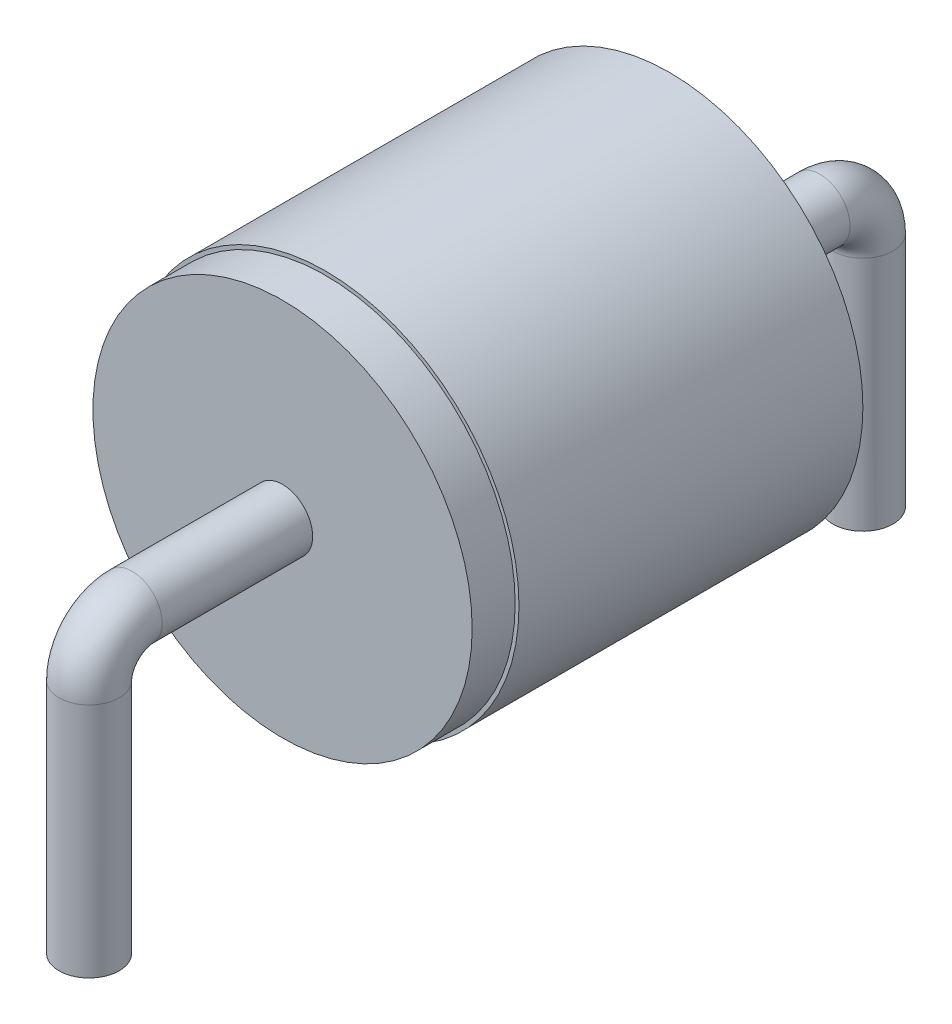
ISO-10303-21;
HEADER;
FILE_DESCRIPTION(('STEP AP214'),'2;1');
FILE_NAME('part.step','',(''),(''),'','','');
FILE_SCHEMA(('AUTOMOTIVE_DESIGN { 1 0 10303 214 1 1 1 1 }'));
ENDSEC;
DATA;
#1=APPLICATION_CONTEXT('core data for automotive mechanical design processes');
#2=APPLICATION_PROTOCOL_DEFINITION('international standard','automotive_design',2000,#1);
#3=PRODUCT_CONTEXT('',#1,'mechanical');
#4=PRODUCT('Part','Part','',(#3));
#5=PRODUCT_RELATED_PRODUCT_CATEGORY('part','',(#4));
#6=PRODUCT_DEFINITION_FORMATION('','',#4);
#7=PRODUCT_DEFINITION_CONTEXT('part definition',#1,'design');
#8=PRODUCT_DEFINITION('design','',#6,#7);
#9=PRODUCT_DEFINITION_SHAPE('','',#8);
#10=(LENGTH_UNIT() NAMED_UNIT(*) SI_UNIT(.MILLI.,.METRE.));
#11=(NAMED_UNIT(*) PLANE_ANGLE_UNIT() SI_UNIT($,.RADIAN.));
#12=(NAMED_UNIT(*) SI_UNIT($,.STERADIAN.) SOLID_ANGLE_UNIT());
#13=UNCERTAINTY_MEASURE_WITH_UNIT(LENGTH_MEASURE(1.E-05),#10,'distance_accuracy_value','');
#14=(GEOMETRIC_REPRESENTATION_CONTEXT(3) GLOBAL_UNCERTAINTY_ASSIGNED_CONTEXT((#13)) GLOBAL_UNIT_ASSIGNED_CONTEXT((#10,
#11,#12)) REPRESENTATION_CONTEXT('',''));
#15=CARTESIAN_POINT('',(0.,0.,0.));
#16=DIRECTION('',(0.,0.,1.));
#17=DIRECTION('',(1.,0.,0.));
#18=AXIS2_PLACEMENT_3D('',#15,#16,#17);
#19=CARTESIAN_POINT('',(0.,0.,4.5));
#20=DIRECTION('',(0.,0.,-1.));
#21=DIRECTION('',(-1.,0.,0.));
#22=AXIS2_PLACEMENT_3D('',#19,#20,#21);
#23=CYLINDRICAL_SURFACE('',#22,4.5);
#24=CARTESIAN_POINT('',(0.,0.,-4.5));
#25=DIRECTION('',(0.,0.,1.));
#26=DIRECTION('',(1.,0.,0.));
#27=AXIS2_PLACEMENT_3D('',#24,#25,#26);
#28=CIRCLE('',#27,4.5);
#29=CARTESIAN_POINT('',(4.5,0.,-4.5));
#30=VERTEX_POINT('',#29);
#31=EDGE_CURVE('E45',#30,#30,#28,.T.);
#32=ORIENTED_EDGE('',*,*,#31,.T.);
#33=EDGE_LOOP('',(#32));
#34=FACE_BOUND('',#33,.T.);
#35=CARTESIAN_POINT('',(0.,0.,3.5));
#36=DIRECTION('',(0.,0.,1.));
#37=DIRECTION('',(1.,0.,0.));
#38=AXIS2_PLACEMENT_3D('',#35,#36,#37);
#39=CIRCLE('',#38,4.5);
#40=CARTESIAN_POINT('',(4.5,0.,3.5));
#41=VERTEX_POINT('',#40);
#42=EDGE_CURVE('E53',#41,#41,#39,.T.);
#43=ORIENTED_EDGE('',*,*,#42,.F.);
#44=EDGE_LOOP('',(#43));
#45=FACE_BOUND('',#44,.T.);
#46=ADVANCED_FACE('F37',(#34,#45),#23,.T.);
#47=CARTESIAN_POINT('',(0.,0.,-4.5));
#48=DIRECTION('',(0.,0.,1.));
#49=DIRECTION('',(1.,0.,0.));
#50=AXIS2_PLACEMENT_3D('',#47,#48,#49);
#51=PLANE('',#50);
#52=CARTESIAN_POINT('',(0.,0.,-4.5));
#53=DIRECTION('',(0.,0.,1.));
#54=DIRECTION('',(1.,0.,0.));
#55=AXIS2_PLACEMENT_3D('',#52,#53,#54);
#56=CIRCLE('',#55,0.7);
#57=CARTESIAN_POINT('',(0.7,0.,-4.5));
#58=VERTEX_POINT('',#57);
#59=EDGE_CURVE('E10',#58,#58,#56,.F.);
#60=ORIENTED_EDGE('',*,*,#59,.F.);
#61=EDGE_LOOP('',(#60));
#62=FACE_BOUND('',#61,.T.);
#63=ORIENTED_EDGE('',*,*,#31,.F.);
#64=EDGE_LOOP('',(#63));
#65=FACE_BOUND('',#64,.T.);
#66=ADVANCED_FACE('F72',(#62,#65),#51,.F.);
#67=CARTESIAN_POINT('',(0.,0.,3.5));
#68=DIRECTION('',(0.,0.,1.));
#69=DIRECTION('',(1.,0.,0.));
#70=AXIS2_PLACEMENT_3D('',#67,#68,#69);
#71=PLANE('',#70);
#72=CARTESIAN_POINT('',(0.,0.,3.5));
#73=DIRECTION('',(0.,0.,1.));
#74=DIRECTION('',(1.,0.,0.));
#75=AXIS2_PLACEMENT_3D('',#72,#73,#74);
#76=CIRCLE('',#75,4.41094768565532);
#77=CARTESIAN_POINT('',(4.41094768565532,0.,3.5));
#78=VERTEX_POINT('',#77);
#79=EDGE_CURVE('E59',#78,#78,#76,.T.);
#80=ORIENTED_EDGE('',*,*,#79,.F.);
#81=EDGE_LOOP('',(#80));
#82=FACE_BOUND('',#81,.T.);
#83=ORIENTED_EDGE('',*,*,#42,.T.);
#84=EDGE_LOOP('',(#83));
#85=FACE_BOUND('',#84,.T.);
#86=ADVANCED_FACE('F69',(#82,#85),#71,.T.);
#87=CARTESIAN_POINT('',(0.,0.,3.5));
#88=DIRECTION('',(0.,0.,1.));
#89=DIRECTION('',(1.,0.,0.));
#90=AXIS2_PLACEMENT_3D('',#87,#88,#89);
#91=CYLINDRICAL_SURFACE('',#90,4.41094768565532);
#92=ORIENTED_EDGE('',*,*,#79,.T.);
#93=EDGE_LOOP('',(#92));
#94=FACE_BOUND('',#93,.T.);
#95=CARTESIAN_POINT('',(0.,0.,4.5));
#96=DIRECTION('',(0.,0.,1.));
#97=DIRECTION('',(1.,0.,0.));
#98=AXIS2_PLACEMENT_3D('',#95,#96,#97);
#99=CIRCLE('',#98,4.41094768565532);
#100=CARTESIAN_POINT('',(4.41094768565532,0.,4.5));
#101=VERTEX_POINT('',#100);
#102=EDGE_CURVE('E63',#101,#101,#99,.T.);
#103=ORIENTED_EDGE('',*,*,#102,.F.);
#104=EDGE_LOOP('',(#103));
#105=FACE_BOUND('',#104,.T.);
#106=ADVANCED_FACE('F83',(#94,#105),#91,.T.);
#107=CARTESIAN_POINT('',(0.,0.,4.5));
#108=DIRECTION('',(0.,0.,1.));
#109=DIRECTION('',(1.,0.,0.));
#110=AXIS2_PLACEMENT_3D('',#107,#108,#109);
#111=PLANE('',#110);
#112=CARTESIAN_POINT('',(0.,0.,4.5));
#113=DIRECTION('',(0.,0.,1.));
#114=DIRECTION('',(1.,0.,0.));
#115=AXIS2_PLACEMENT_3D('',#112,#113,#114);
#116=CIRCLE('',#115,0.7);
#117=CARTESIAN_POINT('',(0.7,0.,4.5));
#118=VERTEX_POINT('',#117);
#119=EDGE_CURVE('E40',#118,#118,#116,.F.);
#120=ORIENTED_EDGE('',*,*,#119,.T.);
#121=EDGE_LOOP('',(#120));
#122=FACE_BOUND('',#121,.T.);
#123=ORIENTED_EDGE('',*,*,#102,.T.);
#124=EDGE_LOOP('',(#123));
#125=FACE_BOUND('',#124,.T.);
#126=ADVANCED_FACE('F87',(#122,#125),#111,.T.);
#127=CARTESIAN_POINT('',(0.,-6.5,9.));
#128=DIRECTION('',(0.,-1.,0.));
#129=DIRECTION('',(1.,0.,0.));
#130=AXIS2_PLACEMENT_3D('',#127,#128,#129);
#131=PLANE('',#130);
#132=CARTESIAN_POINT('',(0.,-6.5,9.));
#133=DIRECTION('',(0.,-1.,0.));
#134=DIRECTION('',(1.,0.,0.));
#135=AXIS2_PLACEMENT_3D('',#132,#133,#134);
#136=CIRCLE('',#135,0.7);
#137=CARTESIAN_POINT('',(0.7,-6.5,9.));
#138=VERTEX_POINT('',#137);
#139=EDGE_CURVE('E130',#138,#138,#136,.T.);
#140=ORIENTED_EDGE('',*,*,#139,.T.);
#141=EDGE_LOOP('',(#140));
#142=FACE_BOUND('',#141,.T.);
#143=ADVANCED_FACE('F89',(#142),#131,.T.);
#144=CARTESIAN_POINT('',(0.,-6.5,9.));
#145=DIRECTION('',(0.,1.,0.));
#146=DIRECTION('',(0.,0.,1.));
#147=AXIS2_PLACEMENT_3D('',#144,#145,#146);
#148=CYLINDRICAL_SURFACE('',#147,0.7);
#149=CARTESIAN_POINT('',(0.,-1.,9.));
#150=DIRECTION('',(0.,-1.,0.));
#151=DIRECTION('',(1.,0.,0.));
#152=AXIS2_PLACEMENT_3D('',#149,#150,#151);
#153=CIRCLE('',#152,0.7);
#154=CARTESIAN_POINT('',(0.,-1.,9.7));
#155=VERTEX_POINT('',#154);
#156=EDGE_CURVE('E127',#155,#155,#153,.T.);
#157=ORIENTED_EDGE('',*,*,#156,.T.);
#158=EDGE_LOOP('',(#157));
#159=FACE_BOUND('',#158,.T.);
#160=ORIENTED_EDGE('',*,*,#139,.F.);
#161=EDGE_LOOP('',(#160));
#162=FACE_BOUND('',#161,.T.);
#163=ADVANCED_FACE('F97',(#159,#162),#148,.T.);
#164=CARTESIAN_POINT('',(0.,-1.,8.));
#165=DIRECTION('',(-1.,0.,0.));
#166=DIRECTION('',(0.,0.,1.));
#167=AXIS2_PLACEMENT_3D('',#164,#165,#166);
#168=TOROIDAL_SURFACE('',#167,0.999999999999999,0.7);
#169=CARTESIAN_POINT('',(0.,0.,8.));
#170=DIRECTION('',(0.,0.,1.));
#171=DIRECTION('',(1.,0.,0.));
#172=AXIS2_PLACEMENT_3D('',#169,#170,#171);
#173=CIRCLE('',#172,0.7);
#174=CARTESIAN_POINT('',(0.,0.699999999999997,8.));
#175=VERTEX_POINT('',#174);
#176=EDGE_CURVE('E135',#175,#175,#173,.T.);
#177=CARTESIAN_POINT('',(0.,-1.,8.));
#178=DIRECTION('',(-1.,0.,0.));
#179=DIRECTION('',(0.,0.,1.));
#180=AXIS2_PLACEMENT_3D('',#177,#178,#179);
#181=CIRCLE('',#180,1.7);
#182=EDGE_CURVE('',#155,#175,#181,.T.);
#183=ORIENTED_EDGE('',*,*,#156,.F.);
#184=ORIENTED_EDGE('',*,*,#176,.T.);
#185=ORIENTED_EDGE('',*,*,#182,.T.);
#186=ORIENTED_EDGE('',*,*,#182,.F.);
#187=EDGE_LOOP('',(#183,#185,#184,#186));
#188=FACE_BOUND('',#187,.T.);
#189=ADVANCED_FACE('F115',(#188),#168,.T.);
#190=CARTESIAN_POINT('',(0.,0.,8.));
#191=DIRECTION('',(0.,0.,-1.));
#192=DIRECTION('',(0.,1.,0.));
#193=AXIS2_PLACEMENT_3D('',#190,#191,#192);
#194=CYLINDRICAL_SURFACE('',#193,0.7);
#195=ORIENTED_EDGE('',*,*,#119,.F.);
#196=EDGE_LOOP('',(#195));
#197=FACE_BOUND('',#196,.T.);
#198=ORIENTED_EDGE('',*,*,#176,.F.);
#199=EDGE_LOOP('',(#198));
#200=FACE_BOUND('',#199,.T.);
#201=ADVANCED_FACE('F112',(#197,#200),#194,.T.);
#202=CARTESIAN_POINT('',(0.,0.,-8.));
#203=DIRECTION('',(0.,0.,1.));
#204=DIRECTION('',(1.,0.,0.));
#205=AXIS2_PLACEMENT_3D('',#202,#203,#204);
#206=CIRCLE('',#205,0.7);
#207=CARTESIAN_POINT('',(0.,0.7,-8.));
#208=VERTEX_POINT('',#207);
#209=EDGE_CURVE('E140',#208,#208,#206,.T.);
#210=ORIENTED_EDGE('',*,*,#209,.T.);
#211=EDGE_LOOP('',(#210));
#212=FACE_BOUND('',#211,.T.);
#213=ORIENTED_EDGE('',*,*,#59,.T.);
#214=EDGE_LOOP('',(#213));
#215=FACE_BOUND('',#214,.T.);
#216=ADVANCED_FACE('F103',(#212,#215),#194,.T.);
#217=CARTESIAN_POINT('',(0.,-6.5,-9.));
#218=DIRECTION('',(0.,1.,0.));
#219=DIRECTION('',(1.,0.,0.));
#220=AXIS2_PLACEMENT_3D('',#217,#218,#219);
#221=PLANE('',#220);
#222=CARTESIAN_POINT('',(0.,-6.5,-9.));
#223=DIRECTION('',(0.,1.,0.));
#224=DIRECTION('',(1.,0.,0.));
#225=AXIS2_PLACEMENT_3D('',#222,#223,#224);
#226=CIRCLE('',#225,0.7);
#227=CARTESIAN_POINT('',(0.7,-6.5,-9.));
#228=VERTEX_POINT('',#227);
#229=EDGE_CURVE('E57',#228,#228,#226,.T.);
#230=ORIENTED_EDGE('',*,*,#229,.F.);
#231=EDGE_LOOP('',(#230));
#232=FACE_BOUND('',#231,.T.);
#233=ADVANCED_FACE('F99',(#232),#221,.F.);
#234=CARTESIAN_POINT('',(0.,-1.,-8.));
#235=DIRECTION('',(-1.,0.,0.));
#236=DIRECTION('',(0.,0.,1.));
#237=AXIS2_PLACEMENT_3D('',#234,#235,#236);
#238=TOROIDAL_SURFACE('',#237,1.,0.7);
#239=CARTESIAN_POINT('',(0.,-1.,-9.));
#240=DIRECTION('',(0.,1.,0.));
#241=DIRECTION('',(1.,0.,0.));
#242=AXIS2_PLACEMENT_3D('',#239,#240,#241);
#243=CIRCLE('',#242,0.7);
#244=CARTESIAN_POINT('',(0.,-1.,-9.7));
#245=VERTEX_POINT('',#244);
#246=EDGE_CURVE('E143',#245,#245,#243,.T.);
#247=CARTESIAN_POINT('',(0.,-1.,-8.));
#248=DIRECTION('',(-1.,0.,0.));
#249=DIRECTION('',(0.,0.,1.));
#250=AXIS2_PLACEMENT_3D('',#247,#248,#249);
#251=CIRCLE('',#250,1.7);
#252=EDGE_CURVE('',#208,#245,#251,.T.);
#253=ORIENTED_EDGE('',*,*,#209,.F.);
#254=ORIENTED_EDGE('',*,*,#246,.T.);
#255=ORIENTED_EDGE('',*,*,#252,.T.);
#256=ORIENTED_EDGE('',*,*,#252,.F.);
#257=EDGE_LOOP('',(#253,#255,#254,#256));
#258=FACE_BOUND('',#257,.T.);
#259=ADVANCED_FACE('F102',(#258),#238,.T.);
#260=CARTESIAN_POINT('',(0.,-1.,-9.));
#261=DIRECTION('',(0.,-1.,0.));
#262=DIRECTION('',(0.,0.,-1.));
#263=AXIS2_PLACEMENT_3D('',#260,#261,#262);
#264=CYLINDRICAL_SURFACE('',#263,0.7);
#265=ORIENTED_EDGE('',*,*,#229,.T.);
#266=EDGE_LOOP('',(#265));
#267=FACE_BOUND('',#266,.T.);
#268=ORIENTED_EDGE('',*,*,#246,.F.);
#269=EDGE_LOOP('',(#268));
#270=FACE_BOUND('',#269,.T.);
#271=ADVANCED_FACE('F105',(#267,#270),#264,.T.);
#272=CLOSED_SHELL('',(#46,#66,#86,#106,#126,#143,#163,#189,#201,#216,#233,#259,#271));
#273=MANIFOLD_SOLID_BREP('B2',#272);
#274=ADVANCED_BREP_SHAPE_REPRESENTATION('',(#18,#273),#14);
#275=SHAPE_DEFINITION_REPRESENTATION(#9,#274);
ENDSEC;
END-ISO-10303-21;
